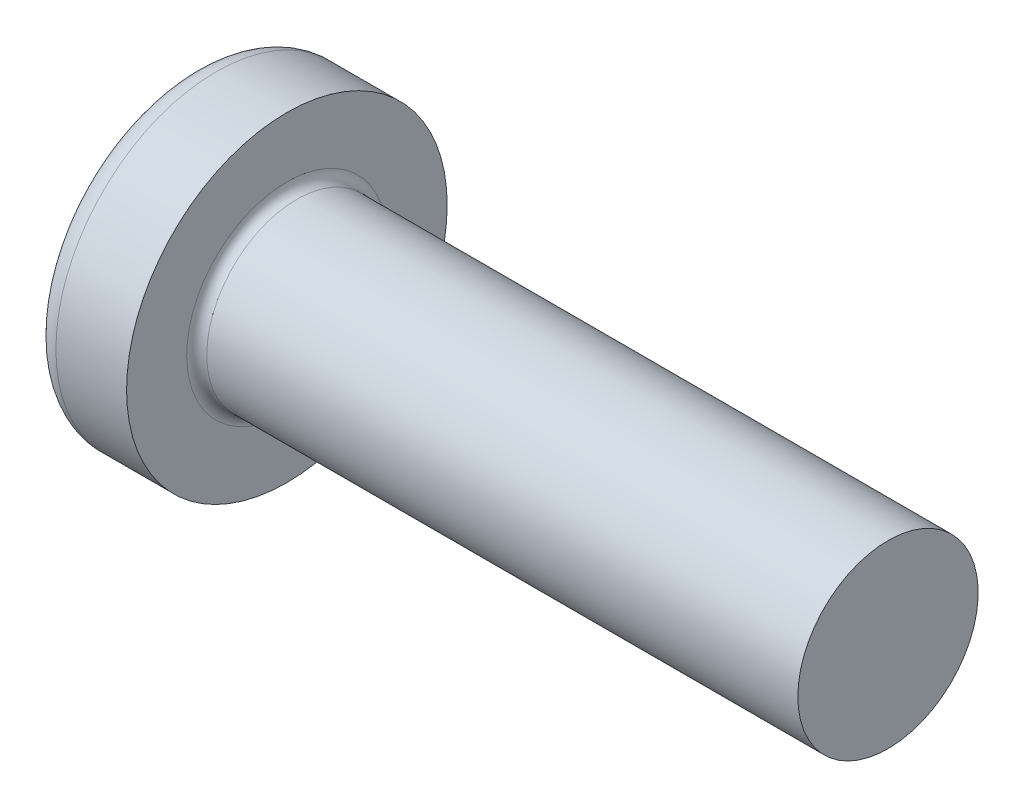
ISO-10303-21;
HEADER;
FILE_DESCRIPTION(('STEP AP214'),'2;1');
FILE_NAME('part.step','',(''),(''),'','','');
FILE_SCHEMA(('AUTOMOTIVE_DESIGN { 1 0 10303 214 1 1 1 1 }'));
ENDSEC;
DATA;
#1=APPLICATION_CONTEXT('core data for automotive mechanical design processes');
#2=APPLICATION_PROTOCOL_DEFINITION('international standard','automotive_design',2000,#1);
#3=PRODUCT_CONTEXT('',#1,'mechanical');
#4=PRODUCT('Part','Part','',(#3));
#5=PRODUCT_RELATED_PRODUCT_CATEGORY('part','',(#4));
#6=PRODUCT_DEFINITION_FORMATION('','',#4);
#7=PRODUCT_DEFINITION_CONTEXT('part definition',#1,'design');
#8=PRODUCT_DEFINITION('design','',#6,#7);
#9=PRODUCT_DEFINITION_SHAPE('','',#8);
#10=(LENGTH_UNIT() NAMED_UNIT(*) SI_UNIT(.MILLI.,.METRE.));
#11=(NAMED_UNIT(*) PLANE_ANGLE_UNIT() SI_UNIT($,.RADIAN.));
#12=(NAMED_UNIT(*) SI_UNIT($,.STERADIAN.) SOLID_ANGLE_UNIT());
#13=UNCERTAINTY_MEASURE_WITH_UNIT(LENGTH_MEASURE(1.E-05),#10,'distance_accuracy_value','');
#14=(GEOMETRIC_REPRESENTATION_CONTEXT(3) GLOBAL_UNCERTAINTY_ASSIGNED_CONTEXT((#13)) GLOBAL_UNIT_ASSIGNED_CONTEXT((#10,
#11,#12)) REPRESENTATION_CONTEXT('',''));
#15=CARTESIAN_POINT('',(0.,0.,0.));
#16=DIRECTION('',(0.,0.,1.));
#17=DIRECTION('',(1.,0.,0.));
#18=AXIS2_PLACEMENT_3D('',#15,#16,#17);
#19=CARTESIAN_POINT('',(0.999999999990897,0.,0.));
#20=DIRECTION('',(-1.,0.,0.));
#21=DIRECTION('',(0.,-1.,0.));
#22=AXIS2_PLACEMENT_3D('',#19,#20,#21);
#23=CONICAL_SURFACE('',#22,0.55599999999778,1.2566370614353);
#24=CARTESIAN_POINT('',(1.18065535109591,0.,2.66453525910038E-12));
#25=VERTEX_POINT('',#24);
#26=VERTEX_LOOP('',#25);
#27=FACE_BOUND('',#26,.T.);
#28=CARTESIAN_POINT('',(0.999999999976353,0.,0.));
#29=DIRECTION('',(-1.,0.,0.));
#30=DIRECTION('',(0.,0.,1.));
#31=AXIS2_PLACEMENT_3D('',#28,#29,#30);
#32=CIRCLE('',#31,0.555999999995963);
#33=CARTESIAN_POINT('',(0.999999999976353,0.,0.555999999996004));
#34=VERTEX_POINT('',#33);
#35=EDGE_CURVE('E284',#34,#34,#32,.T.);
#36=ORIENTED_EDGE('',*,*,#35,.T.);
#37=EDGE_LOOP('',(#36));
#38=FACE_BOUND('',#37,.T.);
#39=ADVANCED_FACE('F16',(#27,#38),#23,.F.);
#40=CARTESIAN_POINT('',(0.999999999999994,0.381418409150162,-0.299999999999993));
#41=DIRECTION('',(0.,0.,1.));
#42=DIRECTION('',(0.,-1.,0.));
#43=AXIS2_PLACEMENT_3D('',#40,#41,#42);
#44=PLANE('',#43);
#45=CARTESIAN_POINT('',(0.791562817040209,-0.485341351413612,-0.299999999999993));
#46=CARTESIAN_POINT('',(0.667770611200951,-0.495508758035292,-0.299999999999993));
#47=CARTESIAN_POINT('',(0.543972449130918,-0.505602572892326,-0.299999999999993));
#48=CARTESIAN_POINT('',(0.296364216339641,-0.525643018768709,-0.299999999999993));
#49=CARTESIAN_POINT('',(0.172554145618765,-0.535589649792588,-0.299999999999993));
#50=CARTESIAN_POINT('',(0.048738118667479,-0.545462689056352,-0.299999999999993));
#51=B_SPLINE_CURVE_WITH_KNOTS('',3,(#45,#46,#47,#48,#49,#50),.UNSPECIFIED.,.F.,.F.,(4,2,4),(0.,
0.372626931759604,0.745253852050803),.UNSPECIFIED.);
#52=CARTESIAN_POINT('',(0.791562817050876,-0.485341351412752,-0.299999999999966));
#53=VERTEX_POINT('',#52);
#54=CARTESIAN_POINT('',(0.048738118665969,-0.545462689056465,-0.299999999999993));
#55=VERTEX_POINT('',#54);
#56=EDGE_CURVE('E231',#53,#55,#51,.T.);
#57=ORIENTED_EDGE('',*,*,#56,.T.);
#58=CARTESIAN_POINT('',(0.0987409813258815,-0.830769564448465,-0.299999999999994));
#59=CARTESIAN_POINT('',(0.0886800574315823,-0.783521112330235,-0.299999999999994));
#60=CARTESIAN_POINT('',(0.0794826902631483,-0.736121313321752,-0.299999999999993));
#61=CARTESIAN_POINT('',(0.0628150693780108,-0.641019021524278,-0.299999999999993));
#62=CARTESIAN_POINT('',(0.0553448156613072,-0.593316528735288,-0.299999999999993));
#63=CARTESIAN_POINT('',(0.0487381186704688,-0.545462689056044,-0.299999999999993));
#64=B_SPLINE_CURVE_WITH_KNOTS('',3,(#58,#59,#60,#61,#62,#63),.UNSPECIFIED.,.F.,.F.,(4,2,4),(0.,
0.144851622634613,0.289703245269226),.UNSPECIFIED.);
#65=CARTESIAN_POINT('',(0.0987409813258791,-0.830769564448471,-0.299999999999966));
#66=VERTEX_POINT('',#65);
#67=EDGE_CURVE('E247',#66,#55,#64,.T.);
#68=ORIENTED_EDGE('',*,*,#67,.F.);
#69=DIRECTION('',(0.89493436774996,0.446197800778958,0.));
#70=VECTOR('',#69,1.);
#71=CARTESIAN_POINT('',(0.999999999999994,-0.381418409150183,-0.299999999999938));
#72=LINE('',#71,#70);
#73=EDGE_CURVE('E257',#66,#53,#72,.T.);
#74=ORIENTED_EDGE('',*,*,#73,.T.);
#75=EDGE_LOOP('',(#57,#68,#74));
#76=FACE_BOUND('',#75,.T.);
#77=ADVANCED_FACE('F239',(#76),#44,.T.);
#78=CARTESIAN_POINT('',(0.999999999999952,-0.300000000000015,-0.381418409150139));
#79=DIRECTION('',(0.,1.,0.));
#80=DIRECTION('',(0.,0.,1.));
#81=AXIS2_PLACEMENT_3D('',#78,#79,#80);
#82=PLANE('',#81);
#83=CARTESIAN_POINT('',(0.0487381186674591,-0.300000000000014,-0.545462689056301));
#84=CARTESIAN_POINT('',(0.172554099742537,-0.300000000000014,-0.53558965344409));
#85=CARTESIAN_POINT('',(0.296364124592056,-0.300000000000014,-0.525643026131265));
#86=CARTESIAN_POINT('',(0.543972265650313,-0.300000000000014,-0.505602587795997));
#87=CARTESIAN_POINT('',(0.667770381858684,-0.300000000000014,-0.495508776769023));
#88=CARTESIAN_POINT('',(0.79156254184113,-0.300000000000014,-0.485341374036906));
#89=B_SPLINE_CURVE_WITH_KNOTS('',3,(#83,#84,#85,#86,#87,#88),.UNSPECIFIED.,.F.,.F.,(4,2,4),(0.,
0.372626782227539,0.745253575923464),.UNSPECIFIED.);
#90=CARTESIAN_POINT('',(0.0487381186659596,-0.300000000000014,-0.545462689045414));
#91=VERTEX_POINT('',#90);
#92=CARTESIAN_POINT('',(0.79156267945137,-0.300000000000017,-0.485341362724352));
#93=VERTEX_POINT('',#92);
#94=EDGE_CURVE('E225',#91,#93,#89,.T.);
#95=ORIENTED_EDGE('',*,*,#94,.T.);
#96=DIRECTION('',(-0.894934367749963,0.,-0.446197800778953));
#97=VECTOR('',#96,1.);
#98=CARTESIAN_POINT('',(0.999999999999981,-0.30000000000002,-0.381418409150141));
#99=LINE('',#98,#97);
#100=CARTESIAN_POINT('',(0.0987409813258685,-0.300000000000012,-0.830769564448426));
#101=VERTEX_POINT('',#100);
#102=EDGE_CURVE('E282',#93,#101,#99,.T.);
#103=ORIENTED_EDGE('',*,*,#102,.T.);
#104=CARTESIAN_POINT('',(4.,-0.300000000000013,0.));
#105=DIRECTION('',(0.,1.,0.));
#106=DIRECTION('',(0.,0.,1.));
#107=AXIS2_PLACEMENT_3D('',#104,#105,#106);
#108=CIRCLE('',#107,3.98873413503583);
#109=EDGE_CURVE('E566',#91,#101,#108,.F.);
#110=ORIENTED_EDGE('',*,*,#109,.F.);
#111=EDGE_LOOP('',(#95,#103,#110));
#112=FACE_BOUND('',#111,.T.);
#113=ADVANCED_FACE('F235',(#112),#82,.T.);
#114=CARTESIAN_POINT('',(0.99999999999998,0.299999999999973,-0.381418409150139));
#115=DIRECTION('',(0.446197800778953,0.,-0.894934367749963));
#116=DIRECTION('',(-0.894934367749963,0.,-0.446197800778953));
#117=AXIS2_PLACEMENT_3D('',#114,#115,#116);
#118=PLANE('',#117);
#119=DIRECTION('',(0.894934367749937,0.,0.446197800779004));
#120=VECTOR('',#119,1.);
#121=CARTESIAN_POINT('',(0.0987409813258816,0.299999999999987,-0.830769564448469));
#122=LINE('',#121,#120);
#123=CARTESIAN_POINT('',(0.0987409813258781,0.299999999999991,-0.830769564448445));
#124=VERTEX_POINT('',#123);
#125=CARTESIAN_POINT('',(0.79156281705506,0.299999999999986,-0.485341351412329));
#126=VERTEX_POINT('',#125);
#127=EDGE_CURVE('E279',#124,#126,#122,.T.);
#128=ORIENTED_EDGE('',*,*,#127,.F.);
#129=CARTESIAN_POINT('',(0.0987409813258743,-0.30000000000001,-0.830769564448423));
#130=CARTESIAN_POINT('',(0.0917996950251973,-0.20000000000001,-0.834230362014759));
#131=CARTESIAN_POINT('',(0.0883290518748587,-0.100000000000009,-0.835960760797926));
#132=CARTESIAN_POINT('',(0.0883290518748588,0.0999999999999916,-0.835960760797926));
#133=CARTESIAN_POINT('',(0.0917996950251974,0.199999999999992,-0.834230362014758));
#134=CARTESIAN_POINT('',(0.0987409813258746,0.299999999999992,-0.830769564448422));
#135=B_SPLINE_CURVE_WITH_KNOTS('',3,(#129,#130,#131,#132,#133,#134),.UNSPECIFIED.,.F.,.F.,(4,2,
4),(0.,0.30022550989953,0.60045101979906),.UNSPECIFIED.);
#136=EDGE_CURVE('E146',#101,#124,#135,.T.);
#137=ORIENTED_EDGE('',*,*,#136,.F.);
#138=ORIENTED_EDGE('',*,*,#102,.F.);
#139=CARTESIAN_POINT('',(1.62081539471837,0.,-0.071891282027389));
#140=DIRECTION('',(0.446197800778953,0.,-0.894934367749963));
#141=DIRECTION('',(-0.894934367749963,0.,-0.446197800778953));
#142=AXIS2_PLACEMENT_3D('',#139,#140,#141);
#143=ELLIPSE('',#142,1.14879176396162,0.507521890142847);
#144=EDGE_CURVE('E230',#93,#126,#143,.T.);
#145=ORIENTED_EDGE('',*,*,#144,.T.);
#146=EDGE_LOOP('',(#128,#137,#138,#145));
#147=FACE_BOUND('',#146,.T.);
#148=ADVANCED_FACE('F238',(#147),#118,.F.);
#149=CARTESIAN_POINT('',(1.00000000000002,0.299999999999983,0.381418409150173));
#150=DIRECTION('',(0.,-1.,0.));
#151=DIRECTION('',(0.,0.,-1.));
#152=AXIS2_PLACEMENT_3D('',#149,#150,#151);
#153=PLANE('',#152);
#154=CARTESIAN_POINT('',(0.79156281704847,0.299999999999986,-0.48534135141287));
#155=CARTESIAN_POINT('',(0.667770611208163,0.299999999999986,-0.495508758034639));
#156=CARTESIAN_POINT('',(0.54397244913708,0.299999999999986,-0.505602572891761));
#157=CARTESIAN_POINT('',(0.296364216343703,0.299999999999986,-0.525643018768318));
#158=CARTESIAN_POINT('',(0.172554145621777,0.299999999999986,-0.535589649792283));
#159=CARTESIAN_POINT('',(0.0487381186694407,0.299999999999986,-0.54546268905613));
#160=B_SPLINE_CURVE_WITH_KNOTS('',3,(#154,#155,#156,#157,#158,#159),.UNSPECIFIED.,.F.,.F.,(4,2,
4),(0.,0.372626931762765,0.745253852057124),.UNSPECIFIED.);
#161=CARTESIAN_POINT('',(0.04873811866695,0.299999999999987,-0.545462689045319));
#162=VERTEX_POINT('',#161);
#163=EDGE_CURVE('E139',#126,#162,#160,.T.);
#164=ORIENTED_EDGE('',*,*,#163,.T.);
#165=CARTESIAN_POINT('',(4.,0.299999999999988,0.));
#166=DIRECTION('',(0.,1.,0.));
#167=DIRECTION('',(0.,0.,1.));
#168=AXIS2_PLACEMENT_3D('',#165,#166,#167);
#169=CIRCLE('',#168,3.98873413503583);
#170=EDGE_CURVE('E126',#124,#162,#169,.T.);
#171=ORIENTED_EDGE('',*,*,#170,.F.);
#172=ORIENTED_EDGE('',*,*,#127,.T.);
#173=EDGE_LOOP('',(#164,#171,#172));
#174=FACE_BOUND('',#173,.T.);
#175=ADVANCED_FACE('F167',(#174),#153,.T.);
#176=CARTESIAN_POINT('',(0.999999999999994,0.381418409150162,-0.299999999999993));
#177=DIRECTION('',(0.,0.,1.));
#178=DIRECTION('',(0.,-1.,0.));
#179=AXIS2_PLACEMENT_3D('',#176,#177,#178);
#180=PLANE('',#179);
#181=CARTESIAN_POINT('',(0.0487381186694855,0.54546268905612,-0.299999999999993));
#182=CARTESIAN_POINT('',(0.172554145621818,0.535589649792275,-0.299999999999993));
#183=CARTESIAN_POINT('',(0.296364216343741,0.525643018768312,-0.299999999999993));
#184=CARTESIAN_POINT('',(0.543972449137109,0.505602572891762,-0.299999999999993));
#185=CARTESIAN_POINT('',(0.667770611208189,0.495508758034643,-0.299999999999993));
#186=CARTESIAN_POINT('',(0.791562817048492,0.485341351412878,-0.299999999999993));
#187=B_SPLINE_CURVE_WITH_KNOTS('',3,(#181,#182,#183,#184,#185,#186),.UNSPECIFIED.,.F.,.F.,(4,2,
4),(0.,0.372626920294347,0.7452538520571),.UNSPECIFIED.);
#188=CARTESIAN_POINT('',(0.0487381186669726,0.545462689056321,-0.299999999999993));
#189=VERTEX_POINT('',#188);
#190=CARTESIAN_POINT('',(0.7915628170551,0.485341351412333,-0.299999999999979));
#191=VERTEX_POINT('',#190);
#192=EDGE_CURVE('E130',#189,#191,#187,.T.);
#193=ORIENTED_EDGE('',*,*,#192,.T.);
#194=DIRECTION('',(-0.89493436774996,0.446197800778958,0.));
#195=VECTOR('',#194,1.);
#196=CARTESIAN_POINT('',(1.00000000000001,0.381418409150165,-0.299999999999965));
#197=LINE('',#196,#195);
#198=CARTESIAN_POINT('',(0.0987409813258784,0.830769564448465,-0.299999999999994));
#199=VERTEX_POINT('',#198);
#200=EDGE_CURVE('E138',#191,#199,#197,.T.);
#201=ORIENTED_EDGE('',*,*,#200,.T.);
#202=CARTESIAN_POINT('',(0.0487381186704913,0.545462689056201,-0.299999999999994));
#203=CARTESIAN_POINT('',(0.0553448156613288,0.593316528735418,-0.299999999999993));
#204=CARTESIAN_POINT('',(0.0628150693780301,0.641019021524382,-0.299999999999993));
#205=CARTESIAN_POINT('',(0.0794826902631602,0.736121313321803,-0.299999999999992));
#206=CARTESIAN_POINT('',(0.088680057431589,0.78352111233026,-0.299999999999992));
#207=CARTESIAN_POINT('',(0.0987409813258815,0.830769564448464,-0.299999999999992));
#208=B_SPLINE_CURVE_WITH_KNOTS('',3,(#202,#203,#204,#205,#206,#207),.UNSPECIFIED.,.F.,.F.,(4,2,
4),(0.,0.144851622634534,0.289703245269067),.UNSPECIFIED.);
#209=EDGE_CURVE('E123',#189,#199,#208,.T.);
#210=ORIENTED_EDGE('',*,*,#209,.F.);
#211=EDGE_LOOP('',(#193,#201,#210));
#212=FACE_BOUND('',#211,.T.);
#213=ADVANCED_FACE('F141',(#212),#180,.T.);
#214=CARTESIAN_POINT('',(1.00000000000001,0.381418409150166,0.30000000000001));
#215=DIRECTION('',(0.446197800778958,0.89493436774996,0.));
#216=DIRECTION('',(-0.89493436774996,0.446197800778958,0.));
#217=AXIS2_PLACEMENT_3D('',#214,#215,#216);
#218=PLANE('',#217);
#219=DIRECTION('',(0.894934367749961,-0.446197800778957,0.));
#220=VECTOR('',#219,1.);
#221=CARTESIAN_POINT('',(0.0987409813258816,0.830769564448464,0.300000000000023));
#222=LINE('',#221,#220);
#223=CARTESIAN_POINT('',(0.0987409813258825,0.830769564448464,0.300000000000023));
#224=VERTEX_POINT('',#223);
#225=CARTESIAN_POINT('',(0.791562817055074,0.48534135141236,0.300000000000023));
#226=VERTEX_POINT('',#225);
#227=EDGE_CURVE('E275',#224,#226,#222,.T.);
#228=ORIENTED_EDGE('',*,*,#227,.F.);
#229=CARTESIAN_POINT('',(0.0987409813258815,0.830769564448463,-0.299999999999994));
#230=CARTESIAN_POINT('',(0.0917996950252064,0.834230362014787,-0.199999999999994));
#231=CARTESIAN_POINT('',(0.0883290518748706,0.835960760797954,-0.0999999999999939));
#232=CARTESIAN_POINT('',(0.0883290518748774,0.835960760797972,0.100000000000004));
#233=CARTESIAN_POINT('',(0.0917996950252199,0.834230362014824,0.200000000000001));
#234=CARTESIAN_POINT('',(0.0987409813259013,0.830769564448517,0.299999999999998));
#235=B_SPLINE_CURVE_WITH_KNOTS('',3,(#229,#230,#231,#232,#233,#234),.UNSPECIFIED.,.F.,.F.,(4,2,
4),(0.,0.300225509899529,0.600451019799049),.UNSPECIFIED.);
#236=EDGE_CURVE('E142',#199,#224,#235,.T.);
#237=ORIENTED_EDGE('',*,*,#236,.F.);
#238=ORIENTED_EDGE('',*,*,#200,.F.);
#239=CARTESIAN_POINT('',(1.62081539471842,0.0718912820273981,0.));
#240=DIRECTION('',(0.446197800778958,0.89493436774996,0.));
#241=DIRECTION('',(-0.89493436774996,0.446197800778958,0.));
#242=AXIS2_PLACEMENT_3D('',#239,#240,#241);
#243=ELLIPSE('',#242,1.1487917639616,0.507521890142843);
#244=EDGE_CURVE('E134',#226,#191,#243,.F.);
#245=ORIENTED_EDGE('',*,*,#244,.F.);
#246=EDGE_LOOP('',(#228,#237,#238,#245));
#247=FACE_BOUND('',#246,.T.);
#248=ADVANCED_FACE('F166',(#247),#218,.F.);
#249=CARTESIAN_POINT('',(0.999999999999994,-0.38141840915018,0.300000000000022));
#250=DIRECTION('',(0.,0.,-1.));
#251=DIRECTION('',(0.,1.,0.));
#252=AXIS2_PLACEMENT_3D('',#249,#250,#251);
#253=PLANE('',#252);
#254=CARTESIAN_POINT('',(0.791562817048476,0.485341351412902,0.300000000000023));
#255=CARTESIAN_POINT('',(0.667770611208171,0.49550875803467,0.300000000000023));
#256=CARTESIAN_POINT('',(0.543972449137091,0.505602572891792,0.300000000000023));
#257=CARTESIAN_POINT('',(0.29636421634372,0.525643018768348,0.300000000000023));
#258=CARTESIAN_POINT('',(0.172554145621796,0.535589649792312,0.300000000000023));
#259=CARTESIAN_POINT('',(0.0487381186694632,0.545462689056159,0.300000000000023));
#260=B_SPLINE_CURVE_WITH_KNOTS('',3,(#254,#255,#256,#257,#258,#259),.UNSPECIFIED.,.F.,.F.,(4,2,
4),(0.,0.372626931762756,0.745253852057107),.UNSPECIFIED.);
#261=CARTESIAN_POINT('',(0.0487381186669612,0.545462689056351,0.300000000000023));
#262=VERTEX_POINT('',#261);
#263=EDGE_CURVE('E211',#226,#262,#260,.T.);
#264=ORIENTED_EDGE('',*,*,#263,.T.);
#265=CARTESIAN_POINT('',(0.0987409813258834,0.830769564448464,0.300000000000022));
#266=CARTESIAN_POINT('',(0.0886800574315911,0.783521112330263,0.300000000000023));
#267=CARTESIAN_POINT('',(0.0794826902631626,0.736121313321808,0.300000000000023));
#268=CARTESIAN_POINT('',(0.0628150693780331,0.641019021524391,0.300000000000023));
#269=CARTESIAN_POINT('',(0.0553448156613321,0.59331652873543,0.300000000000024));
#270=CARTESIAN_POINT('',(0.0487381186704949,0.545462689056215,0.300000000000024));
#271=B_SPLINE_CURVE_WITH_KNOTS('',3,(#265,#266,#267,#268,#269,#270),.UNSPECIFIED.,.F.,.F.,(4,2,
4),(0.,0.144851622634527,0.289703245269053),.UNSPECIFIED.);
#272=EDGE_CURVE('E144',#224,#262,#271,.T.);
#273=ORIENTED_EDGE('',*,*,#272,.F.);
#274=ORIENTED_EDGE('',*,*,#227,.T.);
#275=EDGE_LOOP('',(#264,#273,#274));
#276=FACE_BOUND('',#275,.T.);
#277=ADVANCED_FACE('F505',(#276),#253,.T.);
#278=CARTESIAN_POINT('',(1.00000000000002,0.299999999999983,0.381418409150173));
#279=DIRECTION('',(0.,-1.,0.));
#280=DIRECTION('',(0.,0.,-1.));
#281=AXIS2_PLACEMENT_3D('',#278,#279,#280);
#282=PLANE('',#281);
#283=CARTESIAN_POINT('',(0.0487381186694738,0.299999999999983,0.545462689056206));
#284=CARTESIAN_POINT('',(0.17255414562181,0.299999999999983,0.53558964979236));
#285=CARTESIAN_POINT('',(0.296364216343736,0.299999999999983,0.525643018768398));
#286=CARTESIAN_POINT('',(0.543972449137113,0.299999999999983,0.505602572891847));
#287=CARTESIAN_POINT('',(0.667770611208196,0.299999999999983,0.495508758034728));
#288=CARTESIAN_POINT('',(0.791562817048503,0.299999999999983,0.485341351412963));
#289=B_SPLINE_CURVE_WITH_KNOTS('',3,(#283,#284,#285,#286,#287,#288),.UNSPECIFIED.,.F.,.F.,(4,2,
4),(0.,0.372626920294358,0.745253852057122),.UNSPECIFIED.);
#290=CARTESIAN_POINT('',(0.048738118666967,0.299999999999983,0.545462689045385));
#291=VERTEX_POINT('',#290);
#292=CARTESIAN_POINT('',(0.791562817055064,0.29999999999999,0.485341351412408));
#293=VERTEX_POINT('',#292);
#294=EDGE_CURVE('E205',#291,#293,#289,.T.);
#295=ORIENTED_EDGE('',*,*,#294,.T.);
#296=DIRECTION('',(0.894934367749962,0.,-0.446197800778956));
#297=VECTOR('',#296,1.);
#298=CARTESIAN_POINT('',(0.999999999999967,0.299999999999998,0.38141840915021));
#299=LINE('',#298,#297);
#300=CARTESIAN_POINT('',(0.0987409813258747,0.299999999999977,0.830769564448489));
#301=VERTEX_POINT('',#300);
#302=EDGE_CURVE('E273',#293,#301,#299,.F.);
#303=ORIENTED_EDGE('',*,*,#302,.T.);
#304=CARTESIAN_POINT('',(4.,0.299999999999984,0.));
#305=DIRECTION('',(0.,1.,0.));
#306=DIRECTION('',(0.,0.,1.));
#307=AXIS2_PLACEMENT_3D('',#304,#305,#306);
#308=CIRCLE('',#307,3.98873413503583);
#309=EDGE_CURVE('E585',#291,#301,#308,.T.);
#310=ORIENTED_EDGE('',*,*,#309,.F.);
#311=EDGE_LOOP('',(#295,#303,#310));
#312=FACE_BOUND('',#311,.T.);
#313=ADVANCED_FACE('F496',(#312),#282,.T.);
#314=CARTESIAN_POINT('',(0.999999999999966,-0.300000000000009,0.381418409150208));
#315=DIRECTION('',(0.446197800778956,0.,0.894934367749962));
#316=DIRECTION('',(0.894934367749962,0.,-0.446197800778956));
#317=AXIS2_PLACEMENT_3D('',#314,#315,#316);
#318=PLANE('',#317);
#319=DIRECTION('',(0.894934367749964,0.,-0.446197800778951));
#320=VECTOR('',#319,1.);
#321=CARTESIAN_POINT('',(0.0987409813258816,-0.300000000000019,0.830769564448469));
#322=LINE('',#321,#320);
#323=CARTESIAN_POINT('',(0.0987409813258825,-0.300000000000021,0.830769564448475));
#324=VERTEX_POINT('',#323);
#325=CARTESIAN_POINT('',(0.791562817061541,-0.300000000000017,0.485341351411899));
#326=VERTEX_POINT('',#325);
#327=EDGE_CURVE('E269',#324,#326,#322,.T.);
#328=ORIENTED_EDGE('',*,*,#327,.F.);
#329=CARTESIAN_POINT('',(0.0987409813258837,0.299999999999975,0.830769564448485));
#330=CARTESIAN_POINT('',(0.0917996950252073,0.199999999999978,0.83423036201482));
#331=CARTESIAN_POINT('',(0.088329051874869,0.09999999999998,0.835960760797987));
#332=CARTESIAN_POINT('',(0.088329051874869,-0.100000000000015,0.835960760797986));
#333=CARTESIAN_POINT('',(0.0917996950252071,-0.200000000000013,0.834230362014817));
#334=CARTESIAN_POINT('',(0.0987409813258835,-0.30000000000001,0.830769564448481));
#335=B_SPLINE_CURVE_WITH_KNOTS('',3,(#329,#330,#331,#332,#333,#334),.UNSPECIFIED.,.F.,.F.,(4,2,
4),(0.,0.300225509899521,0.600451019799043),.UNSPECIFIED.);
#336=EDGE_CURVE('E583',#301,#324,#335,.T.);
#337=ORIENTED_EDGE('',*,*,#336,.F.);
#338=ORIENTED_EDGE('',*,*,#302,.F.);
#339=CARTESIAN_POINT('',(1.62081539471832,0.,0.0718912820274719));
#340=DIRECTION('',(0.446197800778956,0.,0.894934367749962));
#341=DIRECTION('',(-0.894934367749962,0.,0.446197800778956));
#342=AXIS2_PLACEMENT_3D('',#339,#340,#341);
#343=ELLIPSE('',#342,1.14879176396163,0.50752189014285);
#344=EDGE_CURVE('E272',#293,#326,#343,.T.);
#345=ORIENTED_EDGE('',*,*,#344,.T.);
#346=EDGE_LOOP('',(#328,#337,#338,#345));
#347=FACE_BOUND('',#346,.T.);
#348=ADVANCED_FACE('F487',(#347),#318,.F.);
#349=CARTESIAN_POINT('',(0.999999999999952,-0.300000000000015,-0.381418409150139));
#350=DIRECTION('',(0.,1.,0.));
#351=DIRECTION('',(0.,0.,1.));
#352=AXIS2_PLACEMENT_3D('',#349,#350,#351);
#353=PLANE('',#352);
#354=CARTESIAN_POINT('',(0.79156281703607,-0.300000000000017,0.485341351413993));
#355=CARTESIAN_POINT('',(0.667770611197502,-0.300000000000018,0.495508758035613));
#356=CARTESIAN_POINT('',(0.543972449128159,-0.300000000000018,0.505602572892589));
#357=CARTESIAN_POINT('',(0.296364216338262,-0.300000000000018,0.525643018768858));
#358=CARTESIAN_POINT('',(0.172554145618075,-0.300000000000018,0.535589649792681));
#359=CARTESIAN_POINT('',(0.0487381186674798,-0.300000000000018,0.545462689056389));
#360=B_SPLINE_CURVE_WITH_KNOTS('',3,(#354,#355,#356,#357,#358,#359),.UNSPECIFIED.,.F.,.F.,(4,2,
4),(0.,0.372626931757527,0.745253852046649),.UNSPECIFIED.);
#361=CARTESIAN_POINT('',(0.0487381186659697,-0.300000000000018,0.545462689045476));
#362=VERTEX_POINT('',#361);
#363=EDGE_CURVE('E196',#326,#362,#360,.T.);
#364=ORIENTED_EDGE('',*,*,#363,.T.);
#365=CARTESIAN_POINT('',(4.,-0.300000000000018,0.));
#366=DIRECTION('',(0.,1.,0.));
#367=DIRECTION('',(0.,0.,1.));
#368=AXIS2_PLACEMENT_3D('',#365,#366,#367);
#369=CIRCLE('',#368,3.98873413503583);
#370=EDGE_CURVE('E578',#324,#362,#369,.F.);
#371=ORIENTED_EDGE('',*,*,#370,.F.);
#372=ORIENTED_EDGE('',*,*,#327,.T.);
#373=EDGE_LOOP('',(#364,#371,#372));
#374=FACE_BOUND('',#373,.T.);
#375=ADVANCED_FACE('F189',(#374),#353,.T.);
#376=CARTESIAN_POINT('',(0.0487381186644596,0.,0.));
#377=DIRECTION('',(-1.,0.,0.));
#378=DIRECTION('',(0.,0.,1.));
#379=AXIS2_PLACEMENT_3D('',#376,#377,#378);
#380=CONICAL_SURFACE('',#379,0.62251871068493,0.0698131700854647);
#381=ORIENTED_EDGE('',*,*,#344,.F.);
#382=ORIENTED_EDGE('',*,*,#294,.F.);
#383=CARTESIAN_POINT('',(0.0487381186644598,0.,0.));
#384=DIRECTION('',(-1.,0.,0.));
#385=DIRECTION('',(0.,0.,1.));
#386=AXIS2_PLACEMENT_3D('',#383,#384,#385);
#387=CIRCLE('',#386,0.62251871068493);
#388=EDGE_CURVE('E127',#262,#291,#387,.F.);
#389=ORIENTED_EDGE('',*,*,#388,.F.);
#390=ORIENTED_EDGE('',*,*,#263,.F.);
#391=ORIENTED_EDGE('',*,*,#244,.T.);
#392=ORIENTED_EDGE('',*,*,#192,.F.);
#393=CARTESIAN_POINT('',(0.0487381186644598,0.,0.));
#394=DIRECTION('',(-1.,0.,0.));
#395=DIRECTION('',(0.,0.,1.));
#396=AXIS2_PLACEMENT_3D('',#393,#394,#395);
#397=CIRCLE('',#396,0.62251871068493);
#398=EDGE_CURVE('E114',#162,#189,#397,.F.);
#399=ORIENTED_EDGE('',*,*,#398,.F.);
#400=ORIENTED_EDGE('',*,*,#163,.F.);
#401=ORIENTED_EDGE('',*,*,#144,.F.);
#402=ORIENTED_EDGE('',*,*,#94,.F.);
#403=CARTESIAN_POINT('',(0.0487381186644596,0.,0.));
#404=DIRECTION('',(-1.,0.,0.));
#405=DIRECTION('',(0.,0.,1.));
#406=AXIS2_PLACEMENT_3D('',#403,#404,#405);
#407=CIRCLE('',#406,0.62251871068493);
#408=EDGE_CURVE('E253',#55,#91,#407,.F.);
#409=ORIENTED_EDGE('',*,*,#408,.F.);
#410=ORIENTED_EDGE('',*,*,#56,.F.);
#411=CARTESIAN_POINT('',(1.62081539471831,-0.0718912820274625,0.));
#412=DIRECTION('',(0.446197800778958,-0.89493436774996,0.));
#413=DIRECTION('',(-0.89493436774996,-0.446197800778958,0.));
#414=AXIS2_PLACEMENT_3D('',#411,#412,#413);
#415=ELLIPSE('',#414,1.14879176396162,0.507521890142851);
#416=CARTESIAN_POINT('',(0.791562817055029,-0.485341351412429,0.30000000000002));
#417=VERTEX_POINT('',#416);
#418=EDGE_CURVE('E254',#53,#417,#415,.F.);
#419=ORIENTED_EDGE('',*,*,#418,.T.);
#420=CARTESIAN_POINT('',(0.0487381186694916,-0.545462689056214,0.300000000000023));
#421=CARTESIAN_POINT('',(0.172554145621828,-0.535589649792368,0.300000000000023));
#422=CARTESIAN_POINT('',(0.296364216343755,-0.525643018768406,0.300000000000023));
#423=CARTESIAN_POINT('',(0.543972449137132,-0.505602572891856,0.300000000000023));
#424=CARTESIAN_POINT('',(0.667770611208216,-0.495508758034738,0.300000000000023));
#425=CARTESIAN_POINT('',(0.791562817048523,-0.485341351412973,0.300000000000022));
#426=B_SPLINE_CURVE_WITH_KNOTS('',3,(#420,#421,#422,#423,#424,#425),.UNSPECIFIED.,.F.,.F.,(4,2,
4),(0.,0.372626920294359,0.745253852057124),.UNSPECIFIED.);
#427=CARTESIAN_POINT('',(0.0487381186699941,-0.545462689056228,0.300000000000022));
#428=VERTEX_POINT('',#427);
#429=EDGE_CURVE('E218',#428,#417,#426,.T.);
#430=ORIENTED_EDGE('',*,*,#429,.F.);
#431=CARTESIAN_POINT('',(0.0487381186644596,0.,0.));
#432=DIRECTION('',(-1.,0.,0.));
#433=DIRECTION('',(0.,0.,1.));
#434=AXIS2_PLACEMENT_3D('',#431,#432,#433);
#435=CIRCLE('',#434,0.62251871068493);
#436=EDGE_CURVE('E576',#362,#428,#435,.F.);
#437=ORIENTED_EDGE('',*,*,#436,.F.);
#438=ORIENTED_EDGE('',*,*,#363,.F.);
#439=EDGE_LOOP('',(#381,#382,#389,#390,#391,#392,#399,#400,#401,#402,#409,#410,#419,#430,#437,#438));
#440=FACE_BOUND('',#439,.T.);
#441=ORIENTED_EDGE('',*,*,#35,.F.);
#442=EDGE_LOOP('',(#441));
#443=FACE_BOUND('',#442,.T.);
#444=ADVANCED_FACE('F131',(#440,#443),#380,.F.);
#445=CARTESIAN_POINT('',(0.999999999999994,-0.38141840915018,0.300000000000022));
#446=DIRECTION('',(0.,0.,-1.));
#447=DIRECTION('',(0.,1.,0.));
#448=AXIS2_PLACEMENT_3D('',#445,#446,#447);
#449=PLANE('',#448);
#450=ORIENTED_EDGE('',*,*,#429,.T.);
#451=DIRECTION('',(0.89493436774996,0.446197800778958,0.));
#452=VECTOR('',#451,1.);
#453=CARTESIAN_POINT('',(0.999999999999994,-0.381418409150183,0.300000000000017));
#454=LINE('',#453,#452);
#455=CARTESIAN_POINT('',(0.0987409813258841,-0.830769564448473,0.30000000000001));
#456=VERTEX_POINT('',#455);
#457=EDGE_CURVE('E261',#417,#456,#454,.F.);
#458=ORIENTED_EDGE('',*,*,#457,.T.);
#459=CARTESIAN_POINT('',(0.0487381186704967,-0.545462689056242,0.300000000000022));
#460=CARTESIAN_POINT('',(0.0553448156613329,-0.593316528735453,0.300000000000022));
#461=CARTESIAN_POINT('',(0.0628150693780333,-0.641019021524411,0.300000000000022));
#462=CARTESIAN_POINT('',(0.0794826902631622,-0.736121313321821,0.300000000000023));
#463=CARTESIAN_POINT('',(0.0886800574315908,-0.783521112330272,0.300000000000023));
#464=CARTESIAN_POINT('',(0.0987409813258834,-0.83076956444847,0.300000000000023));
#465=B_SPLINE_CURVE_WITH_KNOTS('',3,(#459,#460,#461,#462,#463,#464),.UNSPECIFIED.,.F.,.F.,(4,2,
4),(0.,0.144851622634516,0.289703245269031),.UNSPECIFIED.);
#466=EDGE_CURVE('E302',#428,#456,#465,.T.);
#467=ORIENTED_EDGE('',*,*,#466,.F.);
#468=EDGE_LOOP('',(#450,#458,#467));
#469=FACE_BOUND('',#468,.T.);
#470=ADVANCED_FACE('F188',(#469),#449,.T.);
#471=CARTESIAN_POINT('',(0.999999999999994,-0.381418409150183,-0.299999999999995));
#472=DIRECTION('',(0.446197800778958,-0.89493436774996,0.));
#473=DIRECTION('',(0.89493436774996,0.446197800778958,0.));
#474=AXIS2_PLACEMENT_3D('',#471,#472,#473);
#475=PLANE('',#474);
#476=ORIENTED_EDGE('',*,*,#73,.F.);
#477=CARTESIAN_POINT('',(0.0987409813258835,-0.830769564448474,0.300000000000011));
#478=CARTESIAN_POINT('',(0.0917996950252201,-0.834230362014831,0.20000000000001));
#479=CARTESIAN_POINT('',(0.0883290518748898,-0.835960760798014,0.10000000000001));
#480=CARTESIAN_POINT('',(0.0883290518748955,-0.835960760798032,-0.0999999999999774));
#481=CARTESIAN_POINT('',(0.0917996950252305,-0.834230362014868,-0.199999999999964));
#482=CARTESIAN_POINT('',(0.0987409813258975,-0.83076956444853,-0.29999999999995));
#483=B_SPLINE_CURVE_WITH_KNOTS('',3,(#477,#478,#479,#480,#481,#482),.UNSPECIFIED.,.F.,.F.,(4,2,
4),(0.,0.300225509899531,0.600451019799018),.UNSPECIFIED.);
#484=EDGE_CURVE('E297',#456,#66,#483,.T.);
#485=ORIENTED_EDGE('',*,*,#484,.F.);
#486=ORIENTED_EDGE('',*,*,#457,.F.);
#487=ORIENTED_EDGE('',*,*,#418,.F.);
#488=EDGE_LOOP('',(#476,#485,#486,#487));
#489=FACE_BOUND('',#488,.T.);
#490=ADVANCED_FACE('F307',(#489),#475,.F.);
#491=CARTESIAN_POINT('',(4.,0.,0.));
#492=DIRECTION('',(0.,1.,0.));
#493=DIRECTION('',(1.,0.,0.));
#494=AXIS2_PLACEMENT_3D('',#491,#492,#493);
#495=SPHERICAL_SURFACE('',#494,4.);
#496=CARTESIAN_POINT('',(0.270825140390254,0.,0.));
#497=DIRECTION('',(-1.,0.,0.));
#498=DIRECTION('',(0.,0.,1.));
#499=AXIS2_PLACEMENT_3D('',#496,#497,#498);
#500=CIRCLE('',#499,1.44680851063832);
#501=CARTESIAN_POINT('',(0.270825140390254,0.,1.44680851063838));
#502=VERTEX_POINT('',#501);
#503=EDGE_CURVE('E293',#502,#502,#500,.F.);
#504=ORIENTED_EDGE('',*,*,#503,.F.);
#505=EDGE_LOOP('',(#504));
#506=FACE_BOUND('',#505,.T.);
#507=ORIENTED_EDGE('',*,*,#466,.T.);
#508=ORIENTED_EDGE('',*,*,#484,.T.);
#509=ORIENTED_EDGE('',*,*,#67,.T.);
#510=ORIENTED_EDGE('',*,*,#408,.T.);
#511=ORIENTED_EDGE('',*,*,#109,.T.);
#512=ORIENTED_EDGE('',*,*,#136,.T.);
#513=ORIENTED_EDGE('',*,*,#170,.T.);
#514=ORIENTED_EDGE('',*,*,#398,.T.);
#515=ORIENTED_EDGE('',*,*,#209,.T.);
#516=ORIENTED_EDGE('',*,*,#236,.T.);
#517=ORIENTED_EDGE('',*,*,#272,.T.);
#518=ORIENTED_EDGE('',*,*,#388,.T.);
#519=ORIENTED_EDGE('',*,*,#309,.T.);
#520=ORIENTED_EDGE('',*,*,#336,.T.);
#521=ORIENTED_EDGE('',*,*,#370,.T.);
#522=ORIENTED_EDGE('',*,*,#436,.T.);
#523=EDGE_LOOP('',(#507,#508,#509,#510,#511,#512,#513,#514,#515,#516,#517,#518,#519,#520,#521,#522));
#524=FACE_BOUND('',#523,.T.);
#525=ADVANCED_FACE('F120',(#506,#524),#495,.T.);
#526=CARTESIAN_POINT('',(0.494575631966823,0.,0.));
#527=DIRECTION('',(-1.,0.,0.));
#528=DIRECTION('',(0.,0.,1.));
#529=AXIS2_PLACEMENT_3D('',#526,#527,#528);
#530=TOROIDAL_SURFACE('',#529,1.36,0.24);
#531=ORIENTED_EDGE('',*,*,#503,.T.);
#532=EDGE_LOOP('',(#531));
#533=FACE_BOUND('',#532,.T.);
#534=CARTESIAN_POINT('',(0.494575631966823,0.,0.));
#535=DIRECTION('',(-1.,0.,0.));
#536=DIRECTION('',(0.,0.,1.));
#537=AXIS2_PLACEMENT_3D('',#534,#535,#536);
#538=CIRCLE('',#537,1.59999999999999);
#539=CARTESIAN_POINT('',(0.494575631966824,0.,1.59999999999998));
#540=VERTEX_POINT('',#539);
#541=EDGE_CURVE('E296',#540,#540,#538,.F.);
#542=ORIENTED_EDGE('',*,*,#541,.F.);
#543=EDGE_LOOP('',(#542));
#544=FACE_BOUND('',#543,.T.);
#545=ADVANCED_FACE('F316',(#533,#544),#530,.T.);
#546=CARTESIAN_POINT('',(-25.4,0.,0.));
#547=DIRECTION('',(-1.,0.,0.));
#548=DIRECTION('',(0.,0.,1.));
#549=AXIS2_PLACEMENT_3D('',#546,#547,#548);
#550=CYLINDRICAL_SURFACE('',#549,1.59999999999999);
#551=ORIENTED_EDGE('',*,*,#541,.T.);
#552=EDGE_LOOP('',(#551));
#553=FACE_BOUND('',#552,.T.);
#554=CARTESIAN_POINT('',(1.19999999999996,0.,0.));
#555=DIRECTION('',(-1.,0.,0.));
#556=DIRECTION('',(0.,0.,1.));
#557=AXIS2_PLACEMENT_3D('',#554,#555,#556);
#558=CIRCLE('',#557,1.59999999999999);
#559=CARTESIAN_POINT('',(1.19999999999996,0.,1.59999999999998));
#560=VERTEX_POINT('',#559);
#561=EDGE_CURVE('E290',#560,#560,#558,.T.);
#562=ORIENTED_EDGE('',*,*,#561,.T.);
#563=EDGE_LOOP('',(#562));
#564=FACE_BOUND('',#563,.T.);
#565=ADVANCED_FACE('F351',(#553,#564),#550,.T.);
#566=CARTESIAN_POINT('',(1.19999999999996,0.899999999999978,0.));
#567=DIRECTION('',(-1.,0.,0.));
#568=DIRECTION('',(0.,-1.,0.));
#569=AXIS2_PLACEMENT_3D('',#566,#567,#568);
#570=PLANE('',#569);
#571=ORIENTED_EDGE('',*,*,#561,.F.);
#572=EDGE_LOOP('',(#571));
#573=FACE_BOUND('',#572,.T.);
#574=CARTESIAN_POINT('',(1.19999999999993,0.,0.));
#575=DIRECTION('',(1.,0.,0.));
#576=DIRECTION('',(0.,0.,1.));
#577=AXIS2_PLACEMENT_3D('',#574,#575,#576);
#578=CIRCLE('',#577,0.999999999999995);
#579=CARTESIAN_POINT('',(1.19999999999994,0.,-0.999999999999953));
#580=VERTEX_POINT('',#579);
#581=CARTESIAN_POINT('',(1.19999999999994,0.,1.00000000000003));
#582=VERTEX_POINT('',#581);
#583=EDGE_CURVE('E289',#580,#582,#578,.F.);
#584=ORIENTED_EDGE('',*,*,#583,.T.);
#585=CARTESIAN_POINT('',(1.19999999999993,0.,0.));
#586=DIRECTION('',(1.,0.,0.));
#587=DIRECTION('',(0.,0.,-1.));
#588=AXIS2_PLACEMENT_3D('',#585,#586,#587);
#589=CIRCLE('',#588,0.999999999999996);
#590=EDGE_CURVE('E35',#580,#582,#589,.T.);
#591=ORIENTED_EDGE('',*,*,#590,.F.);
#592=EDGE_LOOP('',(#584,#591));
#593=FACE_BOUND('',#592,.T.);
#594=ADVANCED_FACE('F342',(#573,#593),#570,.F.);
#595=CARTESIAN_POINT('',(7.19999999999998,0.899999999999982,0.));
#596=DIRECTION('',(1.,0.,0.));
#597=DIRECTION('',(0.,1.,0.));
#598=AXIS2_PLACEMENT_3D('',#595,#596,#597);
#599=PLANE('',#598);
#600=CARTESIAN_POINT('',(7.19999999999998,0.,0.));
#601=DIRECTION('',(-1.,0.,0.));
#602=DIRECTION('',(0.,0.,1.));
#603=AXIS2_PLACEMENT_3D('',#600,#601,#602);
#604=CIRCLE('',#603,0.899999999999992);
#605=CARTESIAN_POINT('',(7.19999999999998,0.,0.899999999999982));
#606=VERTEX_POINT('',#605);
#607=EDGE_CURVE('E27',#606,#606,#604,.T.);
#608=ORIENTED_EDGE('',*,*,#607,.F.);
#609=EDGE_LOOP('',(#608));
#610=FACE_BOUND('',#609,.T.);
#611=ADVANCED_FACE('F327',(#610),#599,.T.);
#612=CARTESIAN_POINT('',(1.29999999999993,0.,0.));
#613=DIRECTION('',(-1.,0.,0.));
#614=DIRECTION('',(0.,0.,1.));
#615=AXIS2_PLACEMENT_3D('',#612,#613,#614);
#616=TOROIDAL_SURFACE('',#615,1.,0.1);
#617=ORIENTED_EDGE('',*,*,#590,.T.);
#618=ORIENTED_EDGE('',*,*,#583,.F.);
#619=EDGE_LOOP('',(#617,#618));
#620=FACE_BOUND('',#619,.T.);
#621=CARTESIAN_POINT('',(1.29999999999993,0.,0.));
#622=DIRECTION('',(-1.,0.,0.));
#623=DIRECTION('',(0.,0.,1.));
#624=AXIS2_PLACEMENT_3D('',#621,#622,#623);
#625=CIRCLE('',#624,0.899999999999992);
#626=CARTESIAN_POINT('',(1.29999999999993,0.,0.899999999999984));
#627=VERTEX_POINT('',#626);
#628=EDGE_CURVE('E11',#627,#627,#625,.F.);
#629=ORIENTED_EDGE('',*,*,#628,.F.);
#630=EDGE_LOOP('',(#629));
#631=FACE_BOUND('',#630,.T.);
#632=ADVANCED_FACE('F321',(#620,#631),#616,.F.);
#633=CARTESIAN_POINT('',(-25.4,0.,0.));
#634=DIRECTION('',(-1.,0.,0.));
#635=DIRECTION('',(0.,0.,1.));
#636=AXIS2_PLACEMENT_3D('',#633,#634,#635);
#637=CYLINDRICAL_SURFACE('',#636,0.899999999999992);
#638=ORIENTED_EDGE('',*,*,#607,.T.);
#639=EDGE_LOOP('',(#638));
#640=FACE_BOUND('',#639,.T.);
#641=ORIENTED_EDGE('',*,*,#628,.T.);
#642=EDGE_LOOP('',(#641));
#643=FACE_BOUND('',#642,.T.);
#644=ADVANCED_FACE('F319',(#640,#643),#637,.T.);
#645=CLOSED_SHELL('',(#39,#77,#113,#148,#175,#213,#248,#277,#313,#348,#375,#444,#470,#490,#525,
#545,#565,#594,#611,#632,#644));
#646=MANIFOLD_SOLID_BREP('B1',#645);
#647=ADVANCED_BREP_SHAPE_REPRESENTATION('',(#18,#646),#14);
#648=SHAPE_DEFINITION_REPRESENTATION(#9,#647);
ENDSEC;
END-ISO-10303-21;
